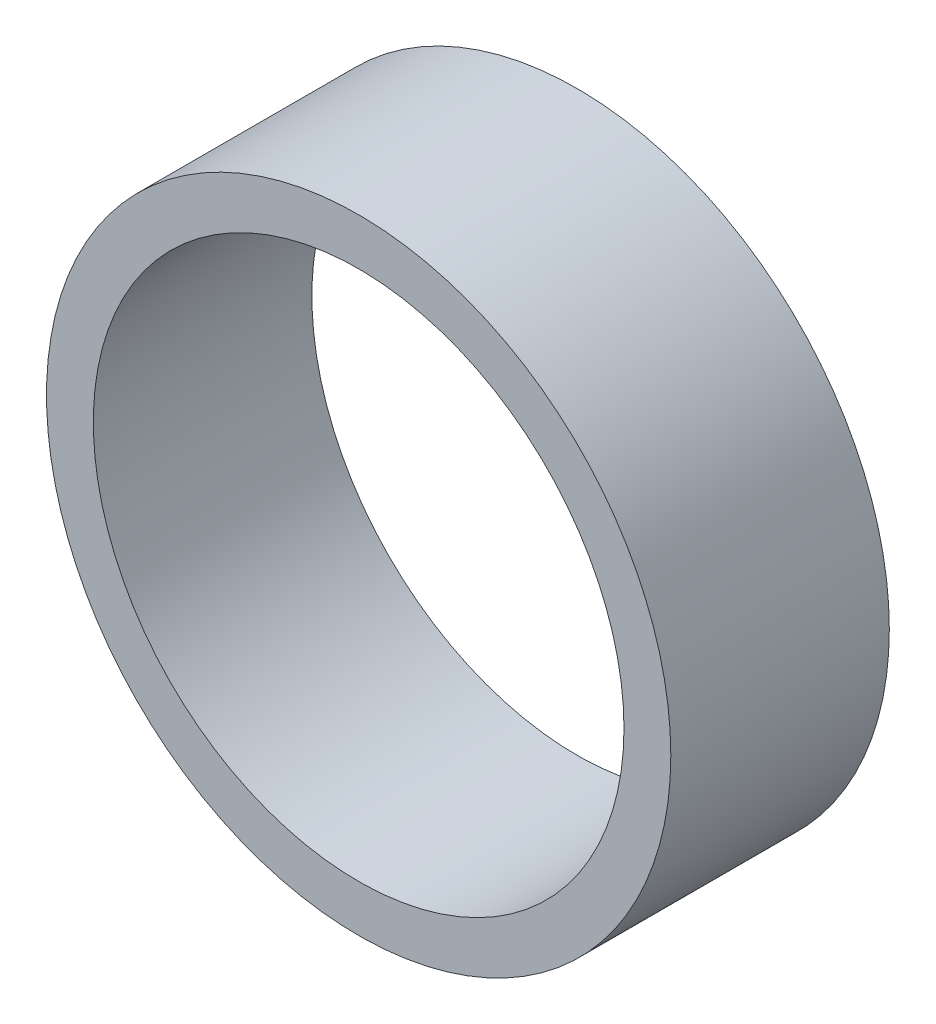
ISO-10303-21;
HEADER;
FILE_DESCRIPTION(('STEP AP214'),'2;1');
FILE_NAME('part.step','',(''),(''),'','','');
FILE_SCHEMA(('AUTOMOTIVE_DESIGN { 1 0 10303 214 1 1 1 1 }'));
ENDSEC;
DATA;
#1=APPLICATION_CONTEXT('core data for automotive mechanical design processes');
#2=APPLICATION_PROTOCOL_DEFINITION('international standard','automotive_design',2000,#1);
#3=PRODUCT_CONTEXT('',#1,'mechanical');
#4=PRODUCT('Part','Part','',(#3));
#5=PRODUCT_RELATED_PRODUCT_CATEGORY('part','',(#4));
#6=PRODUCT_DEFINITION_FORMATION('','',#4);
#7=PRODUCT_DEFINITION_CONTEXT('part definition',#1,'design');
#8=PRODUCT_DEFINITION('design','',#6,#7);
#9=PRODUCT_DEFINITION_SHAPE('','',#8);
#10=(LENGTH_UNIT() NAMED_UNIT(*) SI_UNIT(.MILLI.,.METRE.));
#11=(NAMED_UNIT(*) PLANE_ANGLE_UNIT() SI_UNIT($,.RADIAN.));
#12=(NAMED_UNIT(*) SI_UNIT($,.STERADIAN.) SOLID_ANGLE_UNIT());
#13=UNCERTAINTY_MEASURE_WITH_UNIT(LENGTH_MEASURE(1.E-05),#10,'distance_accuracy_value','');
#14=(GEOMETRIC_REPRESENTATION_CONTEXT(3) GLOBAL_UNCERTAINTY_ASSIGNED_CONTEXT((#13)) GLOBAL_UNIT_ASSIGNED_CONTEXT((#10,
#11,#12)) REPRESENTATION_CONTEXT('',''));
#15=CARTESIAN_POINT('',(0.,0.,0.));
#16=DIRECTION('',(0.,0.,1.));
#17=DIRECTION('',(1.,0.,0.));
#18=AXIS2_PLACEMENT_3D('',#15,#16,#17);
#19=CARTESIAN_POINT('',(0.,0.,7.));
#20=DIRECTION('',(0.,0.,1.));
#21=DIRECTION('',(1.,0.,0.));
#22=AXIS2_PLACEMENT_3D('',#19,#20,#21);
#23=PLANE('',#22);
#24=CARTESIAN_POINT('',(0.,0.,7.));
#25=DIRECTION('',(0.,0.,1.));
#26=DIRECTION('',(1.,0.,0.));
#27=AXIS2_PLACEMENT_3D('',#24,#25,#26);
#28=CIRCLE('',#27,10.);
#29=CARTESIAN_POINT('',(10.,0.,7.));
#30=VERTEX_POINT('',#29);
#31=EDGE_CURVE('E10',#30,#30,#28,.T.);
#32=ORIENTED_EDGE('',*,*,#31,.T.);
#33=EDGE_LOOP('',(#32));
#34=FACE_BOUND('',#33,.T.);
#35=CARTESIAN_POINT('',(0.,0.,7.));
#36=DIRECTION('',(0.,0.,1.));
#37=DIRECTION('',(1.,0.,0.));
#38=AXIS2_PLACEMENT_3D('',#35,#36,#37);
#39=CIRCLE('',#38,8.5);
#40=CARTESIAN_POINT('',(8.5,0.,7.));
#41=VERTEX_POINT('',#40);
#42=EDGE_CURVE('E43',#41,#41,#39,.T.);
#43=ORIENTED_EDGE('',*,*,#42,.F.);
#44=EDGE_LOOP('',(#43));
#45=FACE_BOUND('',#44,.T.);
#46=ADVANCED_FACE('F32',(#34,#45),#23,.T.);
#47=CARTESIAN_POINT('',(0.,0.,0.));
#48=DIRECTION('',(0.,0.,1.));
#49=DIRECTION('',(1.,0.,0.));
#50=AXIS2_PLACEMENT_3D('',#47,#48,#49);
#51=PLANE('',#50);
#52=CARTESIAN_POINT('',(0.,0.,0.));
#53=DIRECTION('',(0.,0.,1.));
#54=DIRECTION('',(1.,0.,0.));
#55=AXIS2_PLACEMENT_3D('',#52,#53,#54);
#56=CIRCLE('',#55,10.);
#57=CARTESIAN_POINT('',(10.,0.,0.));
#58=VERTEX_POINT('',#57);
#59=EDGE_CURVE('E36',#58,#58,#56,.T.);
#60=ORIENTED_EDGE('',*,*,#59,.F.);
#61=EDGE_LOOP('',(#60));
#62=FACE_BOUND('',#61,.T.);
#63=CARTESIAN_POINT('',(0.,0.,0.));
#64=DIRECTION('',(0.,0.,1.));
#65=DIRECTION('',(1.,0.,0.));
#66=AXIS2_PLACEMENT_3D('',#63,#64,#65);
#67=CIRCLE('',#66,8.5);
#68=CARTESIAN_POINT('',(8.5,0.,0.));
#69=VERTEX_POINT('',#68);
#70=EDGE_CURVE('E45',#69,#69,#67,.T.);
#71=ORIENTED_EDGE('',*,*,#70,.T.);
#72=EDGE_LOOP('',(#71));
#73=FACE_BOUND('',#72,.T.);
#74=ADVANCED_FACE('F55',(#62,#73),#51,.F.);
#75=CARTESIAN_POINT('',(0.,0.,7.));
#76=DIRECTION('',(0.,0.,-1.));
#77=DIRECTION('',(-1.,0.,0.));
#78=AXIS2_PLACEMENT_3D('',#75,#76,#77);
#79=CYLINDRICAL_SURFACE('',#78,10.);
#80=ORIENTED_EDGE('',*,*,#31,.F.);
#81=EDGE_LOOP('',(#80));
#82=FACE_BOUND('',#81,.T.);
#83=ORIENTED_EDGE('',*,*,#59,.T.);
#84=EDGE_LOOP('',(#83));
#85=FACE_BOUND('',#84,.T.);
#86=ADVANCED_FACE('F34',(#82,#85),#79,.T.);
#87=CARTESIAN_POINT('',(0.,0.,7.));
#88=DIRECTION('',(0.,0.,-1.));
#89=DIRECTION('',(-1.,0.,0.));
#90=AXIS2_PLACEMENT_3D('',#87,#88,#89);
#91=CYLINDRICAL_SURFACE('',#90,8.5);
#92=ORIENTED_EDGE('',*,*,#42,.T.);
#93=EDGE_LOOP('',(#92));
#94=FACE_BOUND('',#93,.T.);
#95=ORIENTED_EDGE('',*,*,#70,.F.);
#96=EDGE_LOOP('',(#95));
#97=FACE_BOUND('',#96,.T.);
#98=ADVANCED_FACE('F51',(#94,#97),#91,.F.);
#99=CLOSED_SHELL('',(#46,#74,#86,#98));
#100=MANIFOLD_SOLID_BREP('B2',#99);
#101=ADVANCED_BREP_SHAPE_REPRESENTATION('',(#18,#100),#14);
#102=SHAPE_DEFINITION_REPRESENTATION(#9,#101);
ENDSEC;
END-ISO-10303-21;
